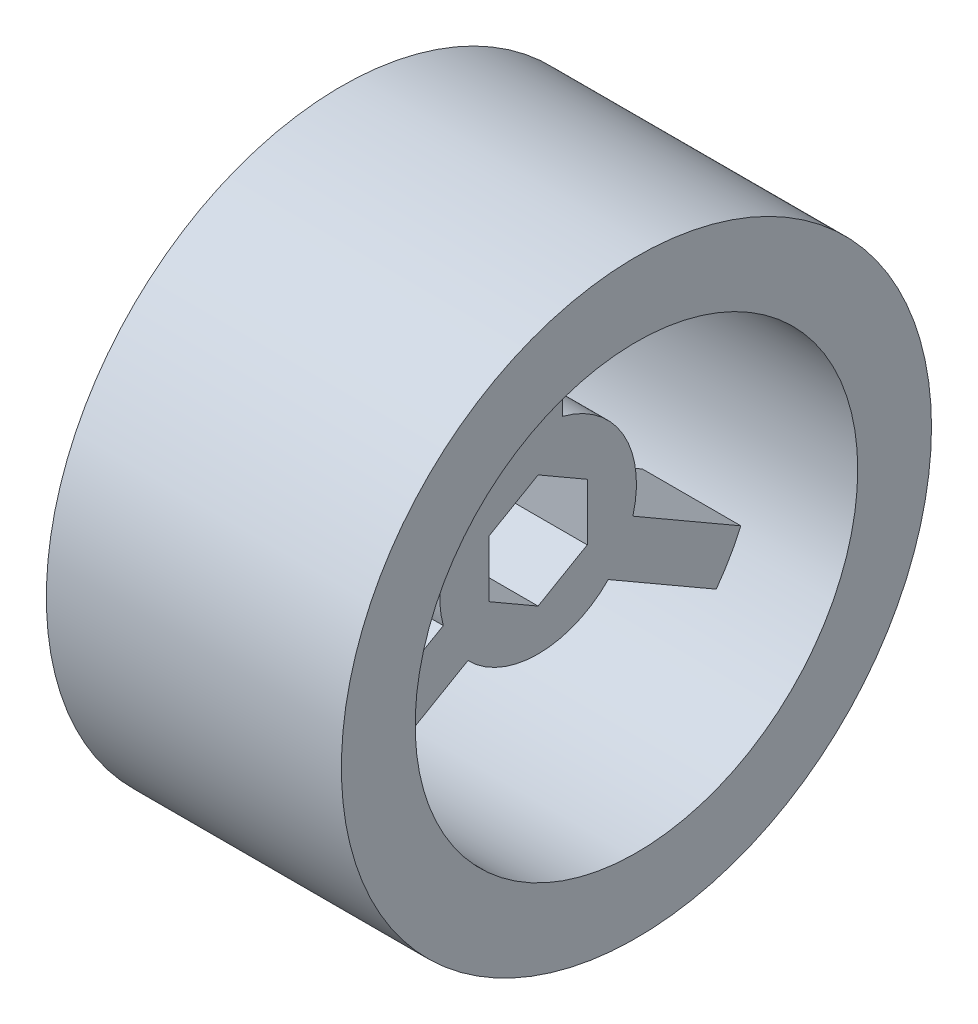
ISO-10303-21;
HEADER;
FILE_DESCRIPTION(('STEP AP214'),'2;1');
FILE_NAME('part.step','',(''),(''),'','','');
FILE_SCHEMA(('AUTOMOTIVE_DESIGN { 1 0 10303 214 1 1 1 1 }'));
ENDSEC;
DATA;
#1=APPLICATION_CONTEXT('core data for automotive mechanical design processes');
#2=APPLICATION_PROTOCOL_DEFINITION('international standard','automotive_design',2000,#1);
#3=PRODUCT_CONTEXT('',#1,'mechanical');
#4=PRODUCT('Part','Part','',(#3));
#5=PRODUCT_RELATED_PRODUCT_CATEGORY('part','',(#4));
#6=PRODUCT_DEFINITION_FORMATION('','',#4);
#7=PRODUCT_DEFINITION_CONTEXT('part definition',#1,'design');
#8=PRODUCT_DEFINITION('design','',#6,#7);
#9=PRODUCT_DEFINITION_SHAPE('','',#8);
#10=(LENGTH_UNIT() NAMED_UNIT(*) SI_UNIT(.MILLI.,.METRE.));
#11=(NAMED_UNIT(*) PLANE_ANGLE_UNIT() SI_UNIT($,.RADIAN.));
#12=(NAMED_UNIT(*) SI_UNIT($,.STERADIAN.) SOLID_ANGLE_UNIT());
#13=UNCERTAINTY_MEASURE_WITH_UNIT(LENGTH_MEASURE(1.E-05),#10,'distance_accuracy_value','');
#14=(GEOMETRIC_REPRESENTATION_CONTEXT(3) GLOBAL_UNCERTAINTY_ASSIGNED_CONTEXT((#13)) GLOBAL_UNIT_ASSIGNED_CONTEXT((#10,
#11,#12)) REPRESENTATION_CONTEXT('',''));
#15=CARTESIAN_POINT('',(0.,0.,0.));
#16=DIRECTION('',(0.,0.,1.));
#17=DIRECTION('',(1.,0.,0.));
#18=AXIS2_PLACEMENT_3D('',#15,#16,#17);
#19=CARTESIAN_POINT('',(12.7,0.,-3.175));
#20=DIRECTION('',(0.,0.,-1.));
#21=DIRECTION('',(0.,1.,0.));
#22=AXIS2_PLACEMENT_3D('',#19,#20,#21);
#23=PLANE('',#22);
#24=DIRECTION('',(0.,-1.,0.));
#25=VECTOR('',#24,1.);
#26=CARTESIAN_POINT('',(0.,0.,-3.175));
#27=LINE('',#26,#25);
#28=CARTESIAN_POINT('',(0.,28.3980633142473,-3.175));
#29=VERTEX_POINT('',#28);
#30=CARTESIAN_POINT('',(0.,12.2967221242085,-3.175));
#31=VERTEX_POINT('',#30);
#32=EDGE_CURVE('E231',#29,#31,#27,.T.);
#33=ORIENTED_EDGE('',*,*,#32,.F.);
#34=DIRECTION('',(-1.,0.,0.));
#35=VECTOR('',#34,1.);
#36=CARTESIAN_POINT('',(12.7,28.3980633142473,-3.175));
#37=LINE('',#36,#35);
#38=CARTESIAN_POINT('',(12.7,28.3980633142473,-3.175));
#39=VERTEX_POINT('',#38);
#40=EDGE_CURVE('E349',#39,#29,#37,.T.);
#41=ORIENTED_EDGE('',*,*,#40,.F.);
#42=DIRECTION('',(0.,-1.,0.));
#43=VECTOR('',#42,1.);
#44=CARTESIAN_POINT('',(12.7,0.,-3.175));
#45=LINE('',#44,#43);
#46=CARTESIAN_POINT('',(12.7,12.2967221242085,-3.175));
#47=VERTEX_POINT('',#46);
#48=EDGE_CURVE('E235',#39,#47,#45,.T.);
#49=ORIENTED_EDGE('',*,*,#48,.T.);
#50=DIRECTION('',(-1.,0.,0.));
#51=VECTOR('',#50,1.);
#52=CARTESIAN_POINT('',(12.7,12.2967221242085,-3.175));
#53=LINE('',#52,#51);
#54=EDGE_CURVE('E271',#47,#31,#53,.T.);
#55=ORIENTED_EDGE('',*,*,#54,.T.);
#56=EDGE_LOOP('',(#33,#41,#49,#55));
#57=FACE_BOUND('',#56,.T.);
#58=ADVANCED_FACE('F43',(#57),#23,.T.);
#59=CARTESIAN_POINT('',(12.7,0.,3.175));
#60=DIRECTION('',(0.,0.,-1.));
#61=DIRECTION('',(0.,1.,0.));
#62=AXIS2_PLACEMENT_3D('',#59,#60,#61);
#63=PLANE('',#62);
#64=DIRECTION('',(0.,-1.,0.));
#65=VECTOR('',#64,1.);
#66=CARTESIAN_POINT('',(0.,0.,3.175));
#67=LINE('',#66,#65);
#68=CARTESIAN_POINT('',(0.,28.3980633142473,3.175));
#69=VERTEX_POINT('',#68);
#70=CARTESIAN_POINT('',(0.,12.2967221242086,3.175));
#71=VERTEX_POINT('',#70);
#72=EDGE_CURVE('E279',#69,#71,#67,.T.);
#73=ORIENTED_EDGE('',*,*,#72,.T.);
#74=DIRECTION('',(-1.,0.,0.));
#75=VECTOR('',#74,1.);
#76=CARTESIAN_POINT('',(12.7,12.2967221242086,3.175));
#77=LINE('',#76,#75);
#78=CARTESIAN_POINT('',(12.7,12.2967221242086,3.175));
#79=VERTEX_POINT('',#78);
#80=EDGE_CURVE('E341',#79,#71,#77,.T.);
#81=ORIENTED_EDGE('',*,*,#80,.F.);
#82=DIRECTION('',(0.,-1.,0.));
#83=VECTOR('',#82,1.);
#84=CARTESIAN_POINT('',(12.7,0.,3.175));
#85=LINE('',#84,#83);
#86=CARTESIAN_POINT('',(12.7,28.3980633142473,3.175));
#87=VERTEX_POINT('',#86);
#88=EDGE_CURVE('E243',#87,#79,#85,.T.);
#89=ORIENTED_EDGE('',*,*,#88,.F.);
#90=DIRECTION('',(-1.,0.,0.));
#91=VECTOR('',#90,1.);
#92=CARTESIAN_POINT('',(12.7,28.3980633142473,3.175));
#93=LINE('',#92,#91);
#94=EDGE_CURVE('E345',#87,#69,#93,.T.);
#95=ORIENTED_EDGE('',*,*,#94,.T.);
#96=EDGE_LOOP('',(#73,#81,#89,#95));
#97=FACE_BOUND('',#96,.T.);
#98=ADVANCED_FACE('F395',(#97),#63,.F.);
#99=CARTESIAN_POINT('',(12.7,0.,0.));
#100=DIRECTION('',(-1.,0.,0.));
#101=DIRECTION('',(0.,0.,1.));
#102=AXIS2_PLACEMENT_3D('',#99,#100,#101);
#103=CYLINDRICAL_SURFACE('',#102,12.7);
#104=CARTESIAN_POINT('',(0.,0.,0.));
#105=DIRECTION('',(1.,0.,0.));
#106=DIRECTION('',(0.,0.,-1.));
#107=AXIS2_PLACEMENT_3D('',#104,#105,#106);
#108=CIRCLE('',#107,12.7);
#109=CARTESIAN_POINT('',(0.,-3.39873040508869,12.2367737428427));
#110=VERTEX_POINT('',#109);
#111=EDGE_CURVE('E284',#71,#110,#108,.T.);
#112=ORIENTED_EDGE('',*,*,#111,.T.);
#113=DIRECTION('',(-1.,0.,0.));
#114=VECTOR('',#113,1.);
#115=CARTESIAN_POINT('',(12.7,-3.39873040508869,12.2367737428427));
#116=LINE('',#115,#114);
#117=CARTESIAN_POINT('',(12.7,-3.39873040508869,12.2367737428427));
#118=VERTEX_POINT('',#117);
#119=EDGE_CURVE('E338',#118,#110,#116,.T.);
#120=ORIENTED_EDGE('',*,*,#119,.F.);
#121=CARTESIAN_POINT('',(12.7,0.,0.));
#122=DIRECTION('',(1.,0.,0.));
#123=DIRECTION('',(0.,0.,-1.));
#124=AXIS2_PLACEMENT_3D('',#121,#122,#123);
#125=CIRCLE('',#124,12.7);
#126=EDGE_CURVE('E248',#79,#118,#125,.T.);
#127=ORIENTED_EDGE('',*,*,#126,.F.);
#128=ORIENTED_EDGE('',*,*,#80,.T.);
#129=EDGE_LOOP('',(#112,#120,#127,#128));
#130=FACE_BOUND('',#129,.T.);
#131=ADVANCED_FACE('F400',(#130),#103,.T.);
#132=CARTESIAN_POINT('',(12.7,2.74963065701559,1.5875));
#133=DIRECTION('',(0.,0.866025403784438,0.5));
#134=DIRECTION('',(0.,-0.5,0.866025403784438));
#135=AXIS2_PLACEMENT_3D('',#132,#133,#134);
#136=PLANE('',#135);
#137=DIRECTION('',(0.,0.5,-0.866025403784438));
#138=VECTOR('',#137,1.);
#139=CARTESIAN_POINT('',(0.,2.74963065701559,1.5875));
#140=LINE('',#139,#138);
#141=CARTESIAN_POINT('',(0.,-11.4494010001081,26.1809442484171));
#142=VERTEX_POINT('',#141);
#143=EDGE_CURVE('E288',#142,#110,#140,.T.);
#144=ORIENTED_EDGE('',*,*,#143,.F.);
#145=DIRECTION('',(-1.,0.,0.));
#146=VECTOR('',#145,1.);
#147=CARTESIAN_POINT('',(12.7,-11.4494010001081,26.1809442484171));
#148=LINE('',#147,#146);
#149=CARTESIAN_POINT('',(12.7,-11.4494010001081,26.1809442484171));
#150=VERTEX_POINT('',#149);
#151=EDGE_CURVE('E334',#150,#142,#148,.T.);
#152=ORIENTED_EDGE('',*,*,#151,.F.);
#153=DIRECTION('',(0.,0.5,-0.866025403784438));
#154=VECTOR('',#153,1.);
#155=CARTESIAN_POINT('',(12.7,2.74963065701559,1.5875));
#156=LINE('',#155,#154);
#157=EDGE_CURVE('E251',#150,#118,#156,.T.);
#158=ORIENTED_EDGE('',*,*,#157,.T.);
#159=ORIENTED_EDGE('',*,*,#119,.T.);
#160=EDGE_LOOP('',(#144,#152,#158,#159));
#161=FACE_BOUND('',#160,.T.);
#162=ADVANCED_FACE('F439',(#161),#136,.T.);
#163=CARTESIAN_POINT('',(12.7,-2.74963065701559,-1.5875));
#164=DIRECTION('',(0.,0.866025403784438,0.5));
#165=DIRECTION('',(0.,-0.5,0.866025403784438));
#166=AXIS2_PLACEMENT_3D('',#163,#164,#165);
#167=PLANE('',#166);
#168=DIRECTION('',(0.,0.5,-0.866025403784438));
#169=VECTOR('',#168,1.);
#170=CARTESIAN_POINT('',(0.,-2.74963065701559,-1.5875));
#171=LINE('',#170,#169);
#172=CARTESIAN_POINT('',(0.,-16.9486623141393,23.0059442484171));
#173=VERTEX_POINT('',#172);
#174=CARTESIAN_POINT('',(0.,-8.89799171911987,9.06177374284275));
#175=VERTEX_POINT('',#174);
#176=EDGE_CURVE('E292',#173,#175,#171,.T.);
#177=ORIENTED_EDGE('',*,*,#176,.T.);
#178=DIRECTION('',(-1.,0.,0.));
#179=VECTOR('',#178,1.);
#180=CARTESIAN_POINT('',(12.7,-8.89799171911987,9.06177374284275));
#181=LINE('',#180,#179);
#182=CARTESIAN_POINT('',(12.7,-8.89799171911987,9.06177374284275));
#183=VERTEX_POINT('',#182);
#184=EDGE_CURVE('E326',#183,#175,#181,.T.);
#185=ORIENTED_EDGE('',*,*,#184,.F.);
#186=DIRECTION('',(0.,0.5,-0.866025403784438));
#187=VECTOR('',#186,1.);
#188=CARTESIAN_POINT('',(12.7,-2.74963065701559,-1.5875));
#189=LINE('',#188,#187);
#190=CARTESIAN_POINT('',(12.7,-16.9486623141393,23.0059442484171));
#191=VERTEX_POINT('',#190);
#192=EDGE_CURVE('E255',#191,#183,#189,.T.);
#193=ORIENTED_EDGE('',*,*,#192,.F.);
#194=DIRECTION('',(-1.,0.,0.));
#195=VECTOR('',#194,1.);
#196=CARTESIAN_POINT('',(12.7,-16.9486623141393,23.0059442484171));
#197=LINE('',#196,#195);
#198=EDGE_CURVE('E330',#191,#173,#197,.T.);
#199=ORIENTED_EDGE('',*,*,#198,.T.);
#200=EDGE_LOOP('',(#177,#185,#193,#199));
#201=FACE_BOUND('',#200,.T.);
#202=ADVANCED_FACE('F441',(#201),#167,.F.);
#203=CARTESIAN_POINT('',(12.7,0.,0.));
#204=DIRECTION('',(-1.,0.,0.));
#205=DIRECTION('',(0.,0.,1.));
#206=AXIS2_PLACEMENT_3D('',#203,#204,#205);
#207=CYLINDRICAL_SURFACE('',#206,12.7);
#208=CARTESIAN_POINT('',(0.,0.,0.));
#209=DIRECTION('',(1.,0.,0.));
#210=DIRECTION('',(0.,0.,-1.));
#211=AXIS2_PLACEMENT_3D('',#208,#209,#210);
#212=CIRCLE('',#211,12.7);
#213=CARTESIAN_POINT('',(0.,-8.89799171911986,-9.06177374284275));
#214=VERTEX_POINT('',#213);
#215=EDGE_CURVE('E295',#175,#214,#212,.T.);
#216=ORIENTED_EDGE('',*,*,#215,.T.);
#217=DIRECTION('',(-1.,0.,0.));
#218=VECTOR('',#217,1.);
#219=CARTESIAN_POINT('',(12.7,-8.89799171911986,-9.06177374284275));
#220=LINE('',#219,#218);
#221=CARTESIAN_POINT('',(12.7,-8.89799171911986,-9.06177374284275));
#222=VERTEX_POINT('',#221);
#223=EDGE_CURVE('E323',#222,#214,#220,.T.);
#224=ORIENTED_EDGE('',*,*,#223,.F.);
#225=CARTESIAN_POINT('',(12.7,0.,0.));
#226=DIRECTION('',(1.,0.,0.));
#227=DIRECTION('',(0.,0.,-1.));
#228=AXIS2_PLACEMENT_3D('',#225,#226,#227);
#229=CIRCLE('',#228,12.7);
#230=EDGE_CURVE('E258',#183,#222,#229,.T.);
#231=ORIENTED_EDGE('',*,*,#230,.F.);
#232=ORIENTED_EDGE('',*,*,#184,.T.);
#233=EDGE_LOOP('',(#216,#224,#231,#232));
#234=FACE_BOUND('',#233,.T.);
#235=ADVANCED_FACE('F447',(#234),#207,.T.);
#236=CARTESIAN_POINT('',(12.7,-2.74963065701559,1.5875));
#237=DIRECTION('',(0.,-0.866025403784439,0.5));
#238=DIRECTION('',(0.,-0.5,-0.866025403784439));
#239=AXIS2_PLACEMENT_3D('',#236,#237,#238);
#240=PLANE('',#239);
#241=DIRECTION('',(0.,0.5,0.866025403784439));
#242=VECTOR('',#241,1.);
#243=CARTESIAN_POINT('',(0.,-2.74963065701559,1.5875));
#244=LINE('',#243,#242);
#245=CARTESIAN_POINT('',(0.,-16.9486623141393,-23.0059442484171));
#246=VERTEX_POINT('',#245);
#247=EDGE_CURVE('E299',#246,#214,#244,.T.);
#248=ORIENTED_EDGE('',*,*,#247,.F.);
#249=DIRECTION('',(-1.,0.,0.));
#250=VECTOR('',#249,1.);
#251=CARTESIAN_POINT('',(12.7,-16.9486623141393,-23.0059442484171));
#252=LINE('',#251,#250);
#253=CARTESIAN_POINT('',(12.7,-16.9486623141393,-23.0059442484171));
#254=VERTEX_POINT('',#253);
#255=EDGE_CURVE('E319',#254,#246,#252,.T.);
#256=ORIENTED_EDGE('',*,*,#255,.F.);
#257=DIRECTION('',(0.,0.5,0.866025403784439));
#258=VECTOR('',#257,1.);
#259=CARTESIAN_POINT('',(12.7,-2.74963065701559,1.5875));
#260=LINE('',#259,#258);
#261=EDGE_CURVE('E261',#254,#222,#260,.T.);
#262=ORIENTED_EDGE('',*,*,#261,.T.);
#263=ORIENTED_EDGE('',*,*,#223,.T.);
#264=EDGE_LOOP('',(#248,#256,#262,#263));
#265=FACE_BOUND('',#264,.T.);
#266=ADVANCED_FACE('F454',(#265),#240,.T.);
#267=CARTESIAN_POINT('',(12.7,2.74963065701559,-1.5875));
#268=DIRECTION('',(0.,-0.866025403784439,0.5));
#269=DIRECTION('',(0.,-0.5,-0.866025403784439));
#270=AXIS2_PLACEMENT_3D('',#267,#268,#269);
#271=PLANE('',#270);
#272=DIRECTION('',(0.,0.5,0.866025403784439));
#273=VECTOR('',#272,1.);
#274=CARTESIAN_POINT('',(0.,2.74963065701559,-1.5875));
#275=LINE('',#274,#273);
#276=CARTESIAN_POINT('',(0.,-11.4494010001081,-26.1809442484171));
#277=VERTEX_POINT('',#276);
#278=CARTESIAN_POINT('',(0.,-3.39873040508868,-12.2367737428428));
#279=VERTEX_POINT('',#278);
#280=EDGE_CURVE('E303',#277,#279,#275,.T.);
#281=ORIENTED_EDGE('',*,*,#280,.T.);
#282=DIRECTION('',(-1.,0.,0.));
#283=VECTOR('',#282,1.);
#284=CARTESIAN_POINT('',(12.7,-3.39873040508868,-12.2367737428428));
#285=LINE('',#284,#283);
#286=CARTESIAN_POINT('',(12.7,-3.39873040508868,-12.2367737428428));
#287=VERTEX_POINT('',#286);
#288=EDGE_CURVE('E311',#287,#279,#285,.T.);
#289=ORIENTED_EDGE('',*,*,#288,.F.);
#290=DIRECTION('',(0.,0.5,0.866025403784439));
#291=VECTOR('',#290,1.);
#292=CARTESIAN_POINT('',(12.7,2.74963065701559,-1.5875));
#293=LINE('',#292,#291);
#294=CARTESIAN_POINT('',(12.7,-11.4494010001081,-26.1809442484171));
#295=VERTEX_POINT('',#294);
#296=EDGE_CURVE('E265',#295,#287,#293,.T.);
#297=ORIENTED_EDGE('',*,*,#296,.F.);
#298=DIRECTION('',(-1.,0.,0.));
#299=VECTOR('',#298,1.);
#300=CARTESIAN_POINT('',(12.7,-11.4494010001081,-26.1809442484171));
#301=LINE('',#300,#299);
#302=EDGE_CURVE('E315',#295,#277,#301,.T.);
#303=ORIENTED_EDGE('',*,*,#302,.T.);
#304=EDGE_LOOP('',(#281,#289,#297,#303));
#305=FACE_BOUND('',#304,.T.);
#306=ADVANCED_FACE('F430',(#305),#271,.F.);
#307=CARTESIAN_POINT('',(12.7,0.,0.));
#308=DIRECTION('',(-1.,0.,0.));
#309=DIRECTION('',(0.,0.,1.));
#310=AXIS2_PLACEMENT_3D('',#307,#308,#309);
#311=CYLINDRICAL_SURFACE('',#310,12.7);
#312=CARTESIAN_POINT('',(0.,0.,0.));
#313=DIRECTION('',(1.,0.,0.));
#314=DIRECTION('',(0.,0.,-1.));
#315=AXIS2_PLACEMENT_3D('',#312,#313,#314);
#316=CIRCLE('',#315,12.7);
#317=EDGE_CURVE('E240',#279,#31,#316,.T.);
#318=ORIENTED_EDGE('',*,*,#317,.T.);
#319=ORIENTED_EDGE('',*,*,#54,.F.);
#320=CARTESIAN_POINT('',(12.7,0.,0.));
#321=DIRECTION('',(1.,0.,0.));
#322=DIRECTION('',(0.,0.,-1.));
#323=AXIS2_PLACEMENT_3D('',#320,#321,#322);
#324=CIRCLE('',#323,12.7);
#325=EDGE_CURVE('E268',#287,#47,#324,.T.);
#326=ORIENTED_EDGE('',*,*,#325,.F.);
#327=ORIENTED_EDGE('',*,*,#288,.T.);
#328=EDGE_LOOP('',(#318,#319,#326,#327));
#329=FACE_BOUND('',#328,.T.);
#330=ADVANCED_FACE('F461',(#329),#311,.T.);
#331=CARTESIAN_POINT('',(12.7,0.,0.));
#332=DIRECTION('',(1.,0.,0.));
#333=DIRECTION('',(0.,0.,-1.));
#334=AXIS2_PLACEMENT_3D('',#331,#332,#333);
#335=PLANE('',#334);
#336=DIRECTION('',(0.,0.5,0.866025403784439));
#337=VECTOR('',#336,1.);
#338=CARTESIAN_POINT('',(12.7,3.66617420935412,-6.35));
#339=LINE('',#338,#337);
#340=CARTESIAN_POINT('',(12.7,3.66617420935412,-6.35));
#341=VERTEX_POINT('',#340);
#342=CARTESIAN_POINT('',(12.7,7.33234841870825,0.));
#343=VERTEX_POINT('',#342);
#344=EDGE_CURVE('E58',#341,#343,#339,.T.);
#345=ORIENTED_EDGE('',*,*,#344,.F.);
#346=DIRECTION('',(0.,1.,0.));
#347=VECTOR('',#346,1.);
#348=CARTESIAN_POINT('',(12.7,-3.66617420935412,-6.35));
#349=LINE('',#348,#347);
#350=CARTESIAN_POINT('',(12.7,-3.66617420935412,-6.35));
#351=VERTEX_POINT('',#350);
#352=EDGE_CURVE('E201',#351,#341,#349,.T.);
#353=ORIENTED_EDGE('',*,*,#352,.F.);
#354=DIRECTION('',(0.,0.5,-0.866025403784439));
#355=VECTOR('',#354,1.);
#356=CARTESIAN_POINT('',(12.7,-7.33234841870825,0.));
#357=LINE('',#356,#355);
#358=CARTESIAN_POINT('',(12.7,-7.33234841870825,0.));
#359=VERTEX_POINT('',#358);
#360=EDGE_CURVE('E194',#359,#351,#357,.T.);
#361=ORIENTED_EDGE('',*,*,#360,.F.);
#362=DIRECTION('',(0.,-0.5,-0.866025403784439));
#363=VECTOR('',#362,1.);
#364=CARTESIAN_POINT('',(12.7,-3.66617420935412,6.35));
#365=LINE('',#364,#363);
#366=CARTESIAN_POINT('',(12.7,-3.66617420935412,6.35));
#367=VERTEX_POINT('',#366);
#368=EDGE_CURVE('E190',#367,#359,#365,.T.);
#369=ORIENTED_EDGE('',*,*,#368,.F.);
#370=DIRECTION('',(0.,-1.,0.));
#371=VECTOR('',#370,1.);
#372=CARTESIAN_POINT('',(12.7,3.66617420935412,6.35));
#373=LINE('',#372,#371);
#374=CARTESIAN_POINT('',(12.7,3.66617420935412,6.35));
#375=VERTEX_POINT('',#374);
#376=EDGE_CURVE('E171',#375,#367,#373,.T.);
#377=ORIENTED_EDGE('',*,*,#376,.F.);
#378=DIRECTION('',(0.,-0.5,0.866025403784439));
#379=VECTOR('',#378,1.);
#380=CARTESIAN_POINT('',(12.7,7.33234841870825,0.));
#381=LINE('',#380,#379);
#382=EDGE_CURVE('E181',#343,#375,#381,.T.);
#383=ORIENTED_EDGE('',*,*,#382,.F.);
#384=EDGE_LOOP('',(#345,#353,#361,#369,#377,#383));
#385=FACE_BOUND('',#384,.T.);
#386=ORIENTED_EDGE('',*,*,#48,.F.);
#387=CARTESIAN_POINT('',(12.7,0.,0.));
#388=DIRECTION('',(1.,0.,0.));
#389=DIRECTION('',(0.,0.,-1.));
#390=AXIS2_PLACEMENT_3D('',#387,#388,#389);
#391=CIRCLE('',#390,28.575);
#392=EDGE_CURVE('E239',#39,#87,#391,.T.);
#393=ORIENTED_EDGE('',*,*,#392,.T.);
#394=ORIENTED_EDGE('',*,*,#88,.T.);
#395=ORIENTED_EDGE('',*,*,#126,.T.);
#396=ORIENTED_EDGE('',*,*,#157,.F.);
#397=EDGE_CURVE('E245',#150,#191,#391,.T.);
#398=ORIENTED_EDGE('',*,*,#397,.T.);
#399=ORIENTED_EDGE('',*,*,#192,.T.);
#400=ORIENTED_EDGE('',*,*,#230,.T.);
#401=ORIENTED_EDGE('',*,*,#261,.F.);
#402=EDGE_CURVE('E244',#254,#295,#391,.T.);
#403=ORIENTED_EDGE('',*,*,#402,.T.);
#404=ORIENTED_EDGE('',*,*,#296,.T.);
#405=ORIENTED_EDGE('',*,*,#325,.T.);
#406=EDGE_LOOP('',(#386,#393,#394,#395,#396,#398,#399,#400,#401,#403,#404,#405));
#407=FACE_BOUND('',#406,.T.);
#408=ADVANCED_FACE('F186',(#385,#407),#335,.T.);
#409=CARTESIAN_POINT('',(0.,0.,0.));
#410=DIRECTION('',(1.,0.,0.));
#411=DIRECTION('',(0.,0.,-1.));
#412=AXIS2_PLACEMENT_3D('',#409,#410,#411);
#413=PLANE('',#412);
#414=DIRECTION('',(0.,1.,0.));
#415=VECTOR('',#414,1.);
#416=CARTESIAN_POINT('',(0.,0.,-6.35));
#417=LINE('',#416,#415);
#418=CARTESIAN_POINT('',(0.,-3.66617420935412,-6.35));
#419=VERTEX_POINT('',#418);
#420=CARTESIAN_POINT('',(0.,3.66617420935412,-6.35));
#421=VERTEX_POINT('',#420);
#422=EDGE_CURVE('E51',#419,#421,#417,.T.);
#423=ORIENTED_EDGE('',*,*,#422,.T.);
#424=DIRECTION('',(0.,0.5,0.866025403784439));
#425=VECTOR('',#424,1.);
#426=CARTESIAN_POINT('',(0.,5.49926131403119,-3.175));
#427=LINE('',#426,#425);
#428=CARTESIAN_POINT('',(0.,7.33234841870825,0.));
#429=VERTEX_POINT('',#428);
#430=EDGE_CURVE('E11',#421,#429,#427,.T.);
#431=ORIENTED_EDGE('',*,*,#430,.T.);
#432=DIRECTION('',(0.,-0.5,0.866025403784439));
#433=VECTOR('',#432,1.);
#434=CARTESIAN_POINT('',(0.,5.49926131403119,3.175));
#435=LINE('',#434,#433);
#436=CARTESIAN_POINT('',(0.,3.66617420935412,6.35));
#437=VERTEX_POINT('',#436);
#438=EDGE_CURVE('E353',#429,#437,#435,.T.);
#439=ORIENTED_EDGE('',*,*,#438,.T.);
#440=DIRECTION('',(0.,-1.,0.));
#441=VECTOR('',#440,1.);
#442=CARTESIAN_POINT('',(0.,0.,6.35));
#443=LINE('',#442,#441);
#444=CARTESIAN_POINT('',(0.,-3.66617420935412,6.35));
#445=VERTEX_POINT('',#444);
#446=EDGE_CURVE('E174',#437,#445,#443,.T.);
#447=ORIENTED_EDGE('',*,*,#446,.T.);
#448=DIRECTION('',(0.,-0.5,-0.866025403784439));
#449=VECTOR('',#448,1.);
#450=CARTESIAN_POINT('',(0.,-5.49926131403118,3.175));
#451=LINE('',#450,#449);
#452=CARTESIAN_POINT('',(0.,-7.33234841870825,0.));
#453=VERTEX_POINT('',#452);
#454=EDGE_CURVE('E358',#445,#453,#451,.T.);
#455=ORIENTED_EDGE('',*,*,#454,.T.);
#456=DIRECTION('',(0.,0.5,-0.866025403784439));
#457=VECTOR('',#456,1.);
#458=CARTESIAN_POINT('',(0.,-5.49926131403118,-3.175));
#459=LINE('',#458,#457);
#460=EDGE_CURVE('E362',#453,#419,#459,.T.);
#461=ORIENTED_EDGE('',*,*,#460,.T.);
#462=EDGE_LOOP('',(#423,#431,#439,#447,#455,#461));
#463=FACE_BOUND('',#462,.T.);
#464=ORIENTED_EDGE('',*,*,#32,.T.);
#465=ORIENTED_EDGE('',*,*,#317,.F.);
#466=ORIENTED_EDGE('',*,*,#280,.F.);
#467=CARTESIAN_POINT('',(0.,0.,0.));
#468=DIRECTION('',(1.,0.,0.));
#469=DIRECTION('',(0.,0.,-1.));
#470=AXIS2_PLACEMENT_3D('',#467,#468,#469);
#471=CIRCLE('',#470,28.575);
#472=EDGE_CURVE('E280',#246,#277,#471,.T.);
#473=ORIENTED_EDGE('',*,*,#472,.F.);
#474=ORIENTED_EDGE('',*,*,#247,.T.);
#475=ORIENTED_EDGE('',*,*,#215,.F.);
#476=ORIENTED_EDGE('',*,*,#176,.F.);
#477=EDGE_CURVE('E281',#142,#173,#471,.T.);
#478=ORIENTED_EDGE('',*,*,#477,.F.);
#479=ORIENTED_EDGE('',*,*,#143,.T.);
#480=ORIENTED_EDGE('',*,*,#111,.F.);
#481=ORIENTED_EDGE('',*,*,#72,.F.);
#482=EDGE_CURVE('E275',#29,#69,#471,.T.);
#483=ORIENTED_EDGE('',*,*,#482,.F.);
#484=EDGE_LOOP('',(#464,#465,#466,#473,#474,#475,#476,#478,#479,#480,#481,#483));
#485=FACE_BOUND('',#484,.T.);
#486=ADVANCED_FACE('F368',(#463,#485),#413,.F.);
#487=CARTESIAN_POINT('',(-12.7,0.,0.));
#488=DIRECTION('',(1.,0.,0.));
#489=DIRECTION('',(0.,0.,-1.));
#490=AXIS2_PLACEMENT_3D('',#487,#488,#489);
#491=CYLINDRICAL_SURFACE('',#490,38.1);
#492=CARTESIAN_POINT('',(-12.7,0.,0.));
#493=DIRECTION('',(1.,0.,0.));
#494=DIRECTION('',(0.,0.,-1.));
#495=AXIS2_PLACEMENT_3D('',#492,#493,#494);
#496=CIRCLE('',#495,38.1);
#497=CARTESIAN_POINT('',(-12.7,0.,-38.1));
#498=VERTEX_POINT('',#497);
#499=EDGE_CURVE('E227',#498,#498,#496,.T.);
#500=CARTESIAN_POINT('',(25.4,0.,0.));
#501=DIRECTION('',(1.,0.,0.));
#502=DIRECTION('',(0.,0.,-1.));
#503=AXIS2_PLACEMENT_3D('',#500,#501,#502);
#504=CIRCLE('',#503,38.1);
#505=CARTESIAN_POINT('',(25.4,0.,-38.1));
#506=VERTEX_POINT('',#505);
#507=EDGE_CURVE('E223',#506,#506,#504,.T.);
#508=CARTESIAN_POINT('',(-12.7,0.,-38.1));
#509=CARTESIAN_POINT('',(-12.303125,0.,-38.1));
#510=CARTESIAN_POINT('',(-11.90625,0.,-38.1));
#511=CARTESIAN_POINT('',(-11.1125,0.,-38.1));
#512=CARTESIAN_POINT('',(-10.715625,0.,-38.1));
#513=CARTESIAN_POINT('',(-9.921875,0.,-38.1));
#514=CARTESIAN_POINT('',(-9.525,0.,-38.1));
#515=CARTESIAN_POINT('',(-8.73125,0.,-38.1));
#516=CARTESIAN_POINT('',(-8.334375,0.,-38.1));
#517=CARTESIAN_POINT('',(-7.540625,0.,-38.1));
#518=CARTESIAN_POINT('',(-7.14375,0.,-38.1));
#519=CARTESIAN_POINT('',(-6.35,0.,-38.1));
#520=CARTESIAN_POINT('',(-5.953125,0.,-38.1));
#521=CARTESIAN_POINT('',(-5.159375,0.,-38.1));
#522=CARTESIAN_POINT('',(-4.7625,0.,-38.1));
#523=CARTESIAN_POINT('',(-3.96875,0.,-38.1));
#524=CARTESIAN_POINT('',(-3.571875,0.,-38.1));
#525=CARTESIAN_POINT('',(-2.778125,0.,-38.1));
#526=CARTESIAN_POINT('',(-2.38125,0.,-38.1));
#527=CARTESIAN_POINT('',(-1.5875,0.,-38.1));
#528=CARTESIAN_POINT('',(-1.190625,0.,-38.1));
#529=CARTESIAN_POINT('',(-0.396875000000001,0.,-38.1));
#530=CARTESIAN_POINT('',(0.,0.,-38.1));
#531=CARTESIAN_POINT('',(0.793749999999998,0.,-38.1));
#532=CARTESIAN_POINT('',(1.190625,0.,-38.1));
#533=CARTESIAN_POINT('',(1.984375,0.,-38.1));
#534=CARTESIAN_POINT('',(2.38125,0.,-38.1));
#535=CARTESIAN_POINT('',(3.175,0.,-38.1));
#536=CARTESIAN_POINT('',(3.571875,0.,-38.1));
#537=CARTESIAN_POINT('',(4.365625,0.,-38.1));
#538=CARTESIAN_POINT('',(4.7625,0.,-38.1));
#539=CARTESIAN_POINT('',(5.55625,0.,-38.1));
#540=CARTESIAN_POINT('',(5.953125,0.,-38.1));
#541=CARTESIAN_POINT('',(6.746875,0.,-38.1));
#542=CARTESIAN_POINT('',(7.14375,0.,-38.1));
#543=CARTESIAN_POINT('',(7.9375,0.,-38.1));
#544=CARTESIAN_POINT('',(8.334375,0.,-38.1));
#545=CARTESIAN_POINT('',(9.128125,0.,-38.1));
#546=CARTESIAN_POINT('',(9.525,0.,-38.1));
#547=CARTESIAN_POINT('',(10.31875,0.,-38.1));
#548=CARTESIAN_POINT('',(10.715625,0.,-38.1));
#549=CARTESIAN_POINT('',(11.509375,0.,-38.1));
#550=CARTESIAN_POINT('',(11.90625,0.,-38.1));
#551=CARTESIAN_POINT('',(12.7,0.,-38.1));
#552=CARTESIAN_POINT('',(13.096875,0.,-38.1));
#553=CARTESIAN_POINT('',(13.890625,0.,-38.1));
#554=CARTESIAN_POINT('',(14.2875,0.,-38.1));
#555=CARTESIAN_POINT('',(15.08125,0.,-38.1));
#556=CARTESIAN_POINT('',(15.478125,0.,-38.1));
#557=CARTESIAN_POINT('',(16.271875,0.,-38.1));
#558=CARTESIAN_POINT('',(16.66875,0.,-38.1));
#559=CARTESIAN_POINT('',(17.4625,0.,-38.1));
#560=CARTESIAN_POINT('',(17.859375,0.,-38.1));
#561=CARTESIAN_POINT('',(18.653125,0.,-38.1));
#562=CARTESIAN_POINT('',(19.05,0.,-38.1));
#563=CARTESIAN_POINT('',(19.84375,0.,-38.1));
#564=CARTESIAN_POINT('',(20.240625,0.,-38.1));
#565=CARTESIAN_POINT('',(21.034375,0.,-38.1));
#566=CARTESIAN_POINT('',(21.43125,0.,-38.1));
#567=CARTESIAN_POINT('',(22.225,0.,-38.1));
#568=CARTESIAN_POINT('',(22.621875,0.,-38.1));
#569=CARTESIAN_POINT('',(23.415625,0.,-38.1));
#570=CARTESIAN_POINT('',(23.8125,0.,-38.1));
#571=CARTESIAN_POINT('',(24.60625,0.,-38.1));
#572=CARTESIAN_POINT('',(25.003125,0.,-38.1));
#573=CARTESIAN_POINT('',(25.4,0.,-38.1));
#574=B_SPLINE_CURVE_WITH_KNOTS('',3,(#508,#509,#510,#511,#512,#513,#514,#515,#516,#517,#518,
#519,#520,#521,#522,#523,#524,#525,#526,#527,#528,#529,#530,#531,#532,#533,#534,#535,#536,#537,
#538,#539,#540,#541,#542,#543,#544,#545,#546,#547,#548,#549,#550,#551,#552,#553,#554,#555,#556,
#557,#558,#559,#560,#561,#562,#563,#564,#565,#566,#567,#568,#569,#570,#571,#572,#573),
.UNSPECIFIED.,.F.,.F.,(4,2,2,2,2,2,2,2,2,2,2,2,2,2,2,2,2,2,2,2,2,2,2,2,2,2,2,2,2,2,2,2,4),(0.,
1.190625,2.38125,3.571875,4.7625,5.953125,7.14375,8.334375,9.525,10.715625,11.90625,13.096875,
14.2875,15.478125,16.66875,17.859375,19.05,20.240625,21.43125,22.621875,23.8125,25.003125,
26.19375,27.384375,28.575,29.765625,30.95625,32.146875,33.3375,34.528125,35.71875,36.909375,
38.1),.UNSPECIFIED.);
#575=EDGE_CURVE('BSEAM467',#498,#506,#574,.T.);
#576=ORIENTED_EDGE('',*,*,#499,.T.);
#577=ORIENTED_EDGE('',*,*,#507,.F.);
#578=ORIENTED_EDGE('',*,*,#575,.T.);
#579=ORIENTED_EDGE('',*,*,#575,.F.);
#580=EDGE_LOOP('',(#576,#578,#577,#579));
#581=FACE_BOUND('',#580,.T.);
#582=ADVANCED_FACE('F467',(#581),#491,.T.);
#583=CARTESIAN_POINT('',(-12.7,0.,0.));
#584=DIRECTION('',(1.,0.,0.));
#585=DIRECTION('',(0.,0.,-1.));
#586=AXIS2_PLACEMENT_3D('',#583,#584,#585);
#587=PLANE('',#586);
#588=CARTESIAN_POINT('',(-12.7,0.,0.));
#589=DIRECTION('',(1.,0.,0.));
#590=DIRECTION('',(0.,0.,-1.));
#591=AXIS2_PLACEMENT_3D('',#588,#589,#590);
#592=CIRCLE('',#591,28.575);
#593=CARTESIAN_POINT('',(-12.7,0.,-28.575));
#594=VERTEX_POINT('',#593);
#595=EDGE_CURVE('E219',#594,#594,#592,.T.);
#596=ORIENTED_EDGE('',*,*,#595,.T.);
#597=EDGE_LOOP('',(#596));
#598=FACE_BOUND('',#597,.T.);
#599=ORIENTED_EDGE('',*,*,#499,.F.);
#600=EDGE_LOOP('',(#599));
#601=FACE_BOUND('',#600,.T.);
#602=ADVANCED_FACE('F472',(#598,#601),#587,.F.);
#603=CARTESIAN_POINT('',(25.4,0.,0.));
#604=DIRECTION('',(1.,0.,0.));
#605=DIRECTION('',(0.,0.,-1.));
#606=AXIS2_PLACEMENT_3D('',#603,#604,#605);
#607=PLANE('',#606);
#608=CARTESIAN_POINT('',(25.4,0.,0.));
#609=DIRECTION('',(1.,0.,0.));
#610=DIRECTION('',(0.,0.,-1.));
#611=AXIS2_PLACEMENT_3D('',#608,#609,#610);
#612=CIRCLE('',#611,28.575);
#613=CARTESIAN_POINT('',(25.4,0.,-28.575));
#614=VERTEX_POINT('',#613);
#615=EDGE_CURVE('E208',#614,#614,#612,.T.);
#616=ORIENTED_EDGE('',*,*,#615,.F.);
#617=EDGE_LOOP('',(#616));
#618=FACE_BOUND('',#617,.T.);
#619=ORIENTED_EDGE('',*,*,#507,.T.);
#620=EDGE_LOOP('',(#619));
#621=FACE_BOUND('',#620,.T.);
#622=ADVANCED_FACE('F390',(#618,#621),#607,.T.);
#623=CARTESIAN_POINT('',(-12.7,0.,0.));
#624=DIRECTION('',(1.,0.,0.));
#625=DIRECTION('',(0.,0.,-1.));
#626=AXIS2_PLACEMENT_3D('',#623,#624,#625);
#627=CYLINDRICAL_SURFACE('',#626,28.575);
#628=ORIENTED_EDGE('',*,*,#392,.F.);
#629=ORIENTED_EDGE('',*,*,#40,.T.);
#630=ORIENTED_EDGE('',*,*,#482,.T.);
#631=ORIENTED_EDGE('',*,*,#94,.F.);
#632=EDGE_LOOP('',(#628,#629,#630,#631));
#633=FACE_BOUND('',#632,.T.);
#634=ORIENTED_EDGE('',*,*,#397,.F.);
#635=ORIENTED_EDGE('',*,*,#151,.T.);
#636=ORIENTED_EDGE('',*,*,#477,.T.);
#637=ORIENTED_EDGE('',*,*,#198,.F.);
#638=EDGE_LOOP('',(#634,#635,#636,#637));
#639=FACE_BOUND('',#638,.T.);
#640=ORIENTED_EDGE('',*,*,#402,.F.);
#641=ORIENTED_EDGE('',*,*,#255,.T.);
#642=ORIENTED_EDGE('',*,*,#472,.T.);
#643=ORIENTED_EDGE('',*,*,#302,.F.);
#644=EDGE_LOOP('',(#640,#641,#642,#643));
#645=FACE_BOUND('',#644,.T.);
#646=ORIENTED_EDGE('',*,*,#595,.F.);
#647=EDGE_LOOP('',(#646));
#648=FACE_BOUND('',#647,.T.);
#649=ORIENTED_EDGE('',*,*,#615,.T.);
#650=EDGE_LOOP('',(#649));
#651=FACE_BOUND('',#650,.T.);
#652=ADVANCED_FACE('F383',(#633,#639,#645,#648,#651),#627,.F.);
#653=CARTESIAN_POINT('',(-25.4,3.66617420935412,-6.35));
#654=DIRECTION('',(0.,0.866025403784439,-0.5));
#655=DIRECTION('',(0.,0.5,0.866025403784439));
#656=AXIS2_PLACEMENT_3D('',#653,#654,#655);
#657=PLANE('',#656);
#658=DIRECTION('',(1.,0.,0.));
#659=VECTOR('',#658,1.);
#660=CARTESIAN_POINT('',(-25.4,3.66617420935412,-6.35));
#661=LINE('',#660,#659);
#662=EDGE_CURVE('E205',#421,#341,#661,.T.);
#663=ORIENTED_EDGE('',*,*,#662,.T.);
#664=ORIENTED_EDGE('',*,*,#344,.T.);
#665=DIRECTION('',(1.,0.,0.));
#666=VECTOR('',#665,1.);
#667=CARTESIAN_POINT('',(-25.4,7.33234841870825,0.));
#668=LINE('',#667,#666);
#669=EDGE_CURVE('E178',#429,#343,#668,.T.);
#670=ORIENTED_EDGE('',*,*,#669,.F.);
#671=ORIENTED_EDGE('',*,*,#430,.F.);
#672=EDGE_LOOP('',(#663,#664,#670,#671));
#673=FACE_BOUND('',#672,.T.);
#674=ADVANCED_FACE('F381',(#673),#657,.F.);
#675=CARTESIAN_POINT('',(-25.4,-3.66617420935412,-6.35));
#676=DIRECTION('',(0.,0.,-1.));
#677=DIRECTION('',(-1.,0.,0.));
#678=AXIS2_PLACEMENT_3D('',#675,#676,#677);
#679=PLANE('',#678);
#680=DIRECTION('',(1.,0.,0.));
#681=VECTOR('',#680,1.);
#682=CARTESIAN_POINT('',(-25.4,-3.66617420935412,-6.35));
#683=LINE('',#682,#681);
#684=EDGE_CURVE('E209',#419,#351,#683,.T.);
#685=ORIENTED_EDGE('',*,*,#684,.T.);
#686=ORIENTED_EDGE('',*,*,#352,.T.);
#687=ORIENTED_EDGE('',*,*,#662,.F.);
#688=ORIENTED_EDGE('',*,*,#422,.F.);
#689=EDGE_LOOP('',(#685,#686,#687,#688));
#690=FACE_BOUND('',#689,.T.);
#691=ADVANCED_FACE('F373',(#690),#679,.F.);
#692=CARTESIAN_POINT('',(-25.4,-7.33234841870825,0.));
#693=DIRECTION('',(0.,-0.866025403784439,-0.5));
#694=DIRECTION('',(0.,0.5,-0.866025403784439));
#695=AXIS2_PLACEMENT_3D('',#692,#693,#694);
#696=PLANE('',#695);
#697=DIRECTION('',(1.,0.,0.));
#698=VECTOR('',#697,1.);
#699=CARTESIAN_POINT('',(-25.4,-7.33234841870825,0.));
#700=LINE('',#699,#698);
#701=EDGE_CURVE('E212',#453,#359,#700,.T.);
#702=ORIENTED_EDGE('',*,*,#701,.T.);
#703=ORIENTED_EDGE('',*,*,#360,.T.);
#704=ORIENTED_EDGE('',*,*,#684,.F.);
#705=ORIENTED_EDGE('',*,*,#460,.F.);
#706=EDGE_LOOP('',(#702,#703,#704,#705));
#707=FACE_BOUND('',#706,.T.);
#708=ADVANCED_FACE('F375',(#707),#696,.F.);
#709=CARTESIAN_POINT('',(-25.4,-3.66617420935412,6.35));
#710=DIRECTION('',(0.,-0.866025403784439,0.5));
#711=DIRECTION('',(0.,-0.5,-0.866025403784439));
#712=AXIS2_PLACEMENT_3D('',#709,#710,#711);
#713=PLANE('',#712);
#714=DIRECTION('',(1.,0.,0.));
#715=VECTOR('',#714,1.);
#716=CARTESIAN_POINT('',(-25.4,-3.66617420935412,6.35));
#717=LINE('',#716,#715);
#718=EDGE_CURVE('E177',#445,#367,#717,.T.);
#719=ORIENTED_EDGE('',*,*,#718,.T.);
#720=ORIENTED_EDGE('',*,*,#368,.T.);
#721=ORIENTED_EDGE('',*,*,#701,.F.);
#722=ORIENTED_EDGE('',*,*,#454,.F.);
#723=EDGE_LOOP('',(#719,#720,#721,#722));
#724=FACE_BOUND('',#723,.T.);
#725=ADVANCED_FACE('F380',(#724),#713,.F.);
#726=CARTESIAN_POINT('',(-25.4,3.66617420935412,6.35));
#727=DIRECTION('',(0.,0.,1.));
#728=DIRECTION('',(0.,-1.,0.));
#729=AXIS2_PLACEMENT_3D('',#726,#727,#728);
#730=PLANE('',#729);
#731=DIRECTION('',(1.,0.,0.));
#732=VECTOR('',#731,1.);
#733=CARTESIAN_POINT('',(-25.4,3.66617420935412,6.35));
#734=LINE('',#733,#732);
#735=EDGE_CURVE('E66',#437,#375,#734,.T.);
#736=ORIENTED_EDGE('',*,*,#735,.T.);
#737=ORIENTED_EDGE('',*,*,#376,.T.);
#738=ORIENTED_EDGE('',*,*,#718,.F.);
#739=ORIENTED_EDGE('',*,*,#446,.F.);
#740=EDGE_LOOP('',(#736,#737,#738,#739));
#741=FACE_BOUND('',#740,.T.);
#742=ADVANCED_FACE('F168',(#741),#730,.F.);
#743=CARTESIAN_POINT('',(-25.4,7.33234841870825,0.));
#744=DIRECTION('',(0.,0.866025403784439,0.5));
#745=DIRECTION('',(0.,-0.5,0.866025403784439));
#746=AXIS2_PLACEMENT_3D('',#743,#744,#745);
#747=PLANE('',#746);
#748=ORIENTED_EDGE('',*,*,#669,.T.);
#749=ORIENTED_EDGE('',*,*,#382,.T.);
#750=ORIENTED_EDGE('',*,*,#735,.F.);
#751=ORIENTED_EDGE('',*,*,#438,.F.);
#752=EDGE_LOOP('',(#748,#749,#750,#751));
#753=FACE_BOUND('',#752,.T.);
#754=ADVANCED_FACE('F182',(#753),#747,.F.);
#755=CLOSED_SHELL('',(#58,#98,#131,#162,#202,#235,#266,#306,#330,#408,#486,#582,#602,#622,#652,
#674,#691,#708,#725,#742,#754));
#756=MANIFOLD_SOLID_BREP('B2',#755);
#757=ADVANCED_BREP_SHAPE_REPRESENTATION('',(#18,#756),#14);
#758=SHAPE_DEFINITION_REPRESENTATION(#9,#757);
ENDSEC;
END-ISO-10303-21;
